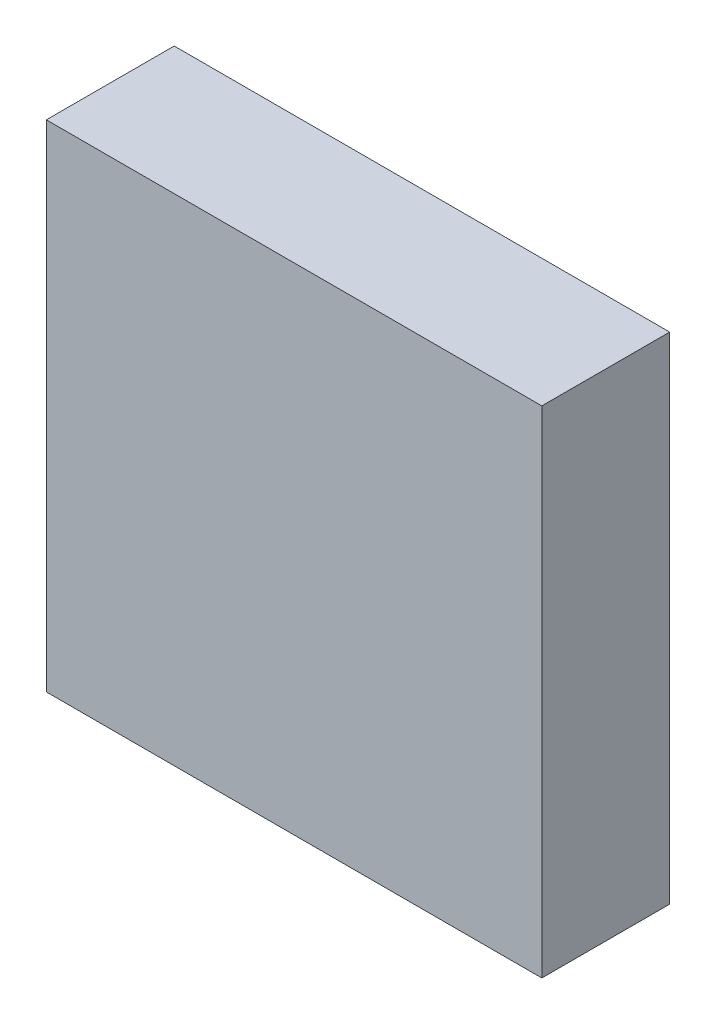
ISO-10303-21;
HEADER;
FILE_DESCRIPTION(('STEP AP214'),'2;1');
FILE_NAME('part.step','',(''),(''),'','','');
FILE_SCHEMA(('AUTOMOTIVE_DESIGN { 1 0 10303 214 1 1 1 1 }'));
ENDSEC;
DATA;
#1=APPLICATION_CONTEXT('core data for automotive mechanical design processes');
#2=APPLICATION_PROTOCOL_DEFINITION('international standard','automotive_design',2000,#1);
#3=PRODUCT_CONTEXT('',#1,'mechanical');
#4=PRODUCT('Part','Part','',(#3));
#5=PRODUCT_RELATED_PRODUCT_CATEGORY('part','',(#4));
#6=PRODUCT_DEFINITION_FORMATION('','',#4);
#7=PRODUCT_DEFINITION_CONTEXT('part definition',#1,'design');
#8=PRODUCT_DEFINITION('design','',#6,#7);
#9=PRODUCT_DEFINITION_SHAPE('','',#8);
#10=(LENGTH_UNIT() NAMED_UNIT(*) SI_UNIT(.MILLI.,.METRE.));
#11=(NAMED_UNIT(*) PLANE_ANGLE_UNIT() SI_UNIT($,.RADIAN.));
#12=(NAMED_UNIT(*) SI_UNIT($,.STERADIAN.) SOLID_ANGLE_UNIT());
#13=UNCERTAINTY_MEASURE_WITH_UNIT(LENGTH_MEASURE(1.E-05),#10,'distance_accuracy_value','');
#14=(GEOMETRIC_REPRESENTATION_CONTEXT(3) GLOBAL_UNCERTAINTY_ASSIGNED_CONTEXT((#13)) GLOBAL_UNIT_ASSIGNED_CONTEXT((#10,
#11,#12)) REPRESENTATION_CONTEXT('',''));
#15=CARTESIAN_POINT('',(0.,0.,0.));
#16=DIRECTION('',(0.,0.,1.));
#17=DIRECTION('',(1.,0.,0.));
#18=AXIS2_PLACEMENT_3D('',#15,#16,#17);
#19=CARTESIAN_POINT('',(-1.54999944,-1.54999944,0.80000094));
#20=DIRECTION('',(0.,0.,1.));
#21=DIRECTION('',(1.,0.,0.));
#22=AXIS2_PLACEMENT_3D('',#19,#20,#21);
#23=PLANE('',#22);
#24=DIRECTION('',(-1.,0.,0.));
#25=VECTOR('',#24,1.);
#26=CARTESIAN_POINT('',(1.54999944,-1.54999944,0.80000094));
#27=LINE('',#26,#25);
#28=CARTESIAN_POINT('',(1.54999944,-1.54999944,0.80000094));
#29=VERTEX_POINT('',#28);
#30=CARTESIAN_POINT('',(-1.54999944,-1.54999944,0.80000094));
#31=VERTEX_POINT('',#30);
#32=EDGE_CURVE('E26',#29,#31,#27,.T.);
#33=ORIENTED_EDGE('',*,*,#32,.F.);
#34=DIRECTION('',(0.,-1.,0.));
#35=VECTOR('',#34,1.);
#36=CARTESIAN_POINT('',(1.54999944,1.54999944,0.80000094));
#37=LINE('',#36,#35);
#38=CARTESIAN_POINT('',(1.54999944,1.54999944,0.80000094));
#39=VERTEX_POINT('',#38);
#40=EDGE_CURVE('E20',#39,#29,#37,.T.);
#41=ORIENTED_EDGE('',*,*,#40,.F.);
#42=DIRECTION('',(1.,0.,0.));
#43=VECTOR('',#42,1.);
#44=CARTESIAN_POINT('',(-1.54999944,1.54999944,0.80000094));
#45=LINE('',#44,#43);
#46=CARTESIAN_POINT('',(-1.54999944,1.54999944,0.80000094));
#47=VERTEX_POINT('',#46);
#48=EDGE_CURVE('E94',#47,#39,#45,.T.);
#49=ORIENTED_EDGE('',*,*,#48,.F.);
#50=DIRECTION('',(0.,1.,0.));
#51=VECTOR('',#50,1.);
#52=CARTESIAN_POINT('',(-1.54999944,-1.54999944,0.80000094));
#53=LINE('',#52,#51);
#54=EDGE_CURVE('E97',#31,#47,#53,.T.);
#55=ORIENTED_EDGE('',*,*,#54,.F.);
#56=EDGE_LOOP('',(#33,#41,#49,#55));
#57=FACE_BOUND('',#56,.T.);
#58=ADVANCED_FACE('F16',(#57),#23,.T.);
#59=CARTESIAN_POINT('',(-1.54999944,-1.54999944,0.));
#60=DIRECTION('',(0.,0.,1.));
#61=DIRECTION('',(1.,0.,0.));
#62=AXIS2_PLACEMENT_3D('',#59,#60,#61);
#63=PLANE('',#62);
#64=DIRECTION('',(0.,1.,0.));
#65=VECTOR('',#64,1.);
#66=CARTESIAN_POINT('',(-1.54999944,-1.54999944,0.));
#67=LINE('',#66,#65);
#68=CARTESIAN_POINT('',(-1.54999944,-1.54999944,0.));
#69=VERTEX_POINT('',#68);
#70=CARTESIAN_POINT('',(-1.54999944,1.54999944,0.));
#71=VERTEX_POINT('',#70);
#72=EDGE_CURVE('E89',#69,#71,#67,.T.);
#73=ORIENTED_EDGE('',*,*,#72,.T.);
#74=DIRECTION('',(1.,0.,0.));
#75=VECTOR('',#74,1.);
#76=CARTESIAN_POINT('',(-1.54999944,1.54999944,0.));
#77=LINE('',#76,#75);
#78=CARTESIAN_POINT('',(1.54999944,1.54999944,0.));
#79=VERTEX_POINT('',#78);
#80=EDGE_CURVE('E80',#71,#79,#77,.T.);
#81=ORIENTED_EDGE('',*,*,#80,.T.);
#82=DIRECTION('',(0.,-1.,0.));
#83=VECTOR('',#82,1.);
#84=CARTESIAN_POINT('',(1.54999944,1.54999944,0.));
#85=LINE('',#84,#83);
#86=CARTESIAN_POINT('',(1.54999944,-1.54999944,0.));
#87=VERTEX_POINT('',#86);
#88=EDGE_CURVE('E205',#79,#87,#85,.T.);
#89=ORIENTED_EDGE('',*,*,#88,.T.);
#90=DIRECTION('',(-1.,0.,0.));
#91=VECTOR('',#90,1.);
#92=CARTESIAN_POINT('',(1.54999944,-1.54999944,0.));
#93=LINE('',#92,#91);
#94=EDGE_CURVE('E11',#87,#69,#93,.T.);
#95=ORIENTED_EDGE('',*,*,#94,.T.);
#96=EDGE_LOOP('',(#73,#81,#89,#95));
#97=FACE_BOUND('',#96,.T.);
#98=ADVANCED_FACE('F90',(#97),#63,.F.);
#99=CARTESIAN_POINT('',(1.54999944,-1.54999944,0.));
#100=DIRECTION('',(0.,-1.,0.));
#101=DIRECTION('',(0.,0.,-1.));
#102=AXIS2_PLACEMENT_3D('',#99,#100,#101);
#103=PLANE('',#102);
#104=DIRECTION('',(0.,0.,1.));
#105=VECTOR('',#104,1.);
#106=CARTESIAN_POINT('',(1.54999944,-1.54999944,0.));
#107=LINE('',#106,#105);
#108=EDGE_CURVE('E116',#87,#29,#107,.T.);
#109=ORIENTED_EDGE('',*,*,#108,.T.);
#110=ORIENTED_EDGE('',*,*,#32,.T.);
#111=DIRECTION('',(0.,0.,1.));
#112=VECTOR('',#111,1.);
#113=CARTESIAN_POINT('',(-1.54999944,-1.54999944,0.));
#114=LINE('',#113,#112);
#115=EDGE_CURVE('E104',#69,#31,#114,.T.);
#116=ORIENTED_EDGE('',*,*,#115,.F.);
#117=ORIENTED_EDGE('',*,*,#94,.F.);
#118=EDGE_LOOP('',(#109,#110,#116,#117));
#119=FACE_BOUND('',#118,.T.);
#120=ADVANCED_FACE('F114',(#119),#103,.T.);
#121=CARTESIAN_POINT('',(1.54999944,1.54999944,0.));
#122=DIRECTION('',(1.,0.,0.));
#123=DIRECTION('',(0.,1.,0.));
#124=AXIS2_PLACEMENT_3D('',#121,#122,#123);
#125=PLANE('',#124);
#126=DIRECTION('',(0.,0.,1.));
#127=VECTOR('',#126,1.);
#128=CARTESIAN_POINT('',(1.54999944,1.54999944,0.));
#129=LINE('',#128,#127);
#130=EDGE_CURVE('E86',#79,#39,#129,.T.);
#131=ORIENTED_EDGE('',*,*,#130,.T.);
#132=ORIENTED_EDGE('',*,*,#40,.T.);
#133=ORIENTED_EDGE('',*,*,#108,.F.);
#134=ORIENTED_EDGE('',*,*,#88,.F.);
#135=EDGE_LOOP('',(#131,#132,#133,#134));
#136=FACE_BOUND('',#135,.T.);
#137=ADVANCED_FACE('F18',(#136),#125,.T.);
#138=CARTESIAN_POINT('',(-1.54999944,1.54999944,0.));
#139=DIRECTION('',(0.,1.,0.));
#140=DIRECTION('',(1.,0.,0.));
#141=AXIS2_PLACEMENT_3D('',#138,#139,#140);
#142=PLANE('',#141);
#143=DIRECTION('',(0.,0.,1.));
#144=VECTOR('',#143,1.);
#145=CARTESIAN_POINT('',(-1.54999944,1.54999944,0.));
#146=LINE('',#145,#144);
#147=EDGE_CURVE('E84',#71,#47,#146,.T.);
#148=ORIENTED_EDGE('',*,*,#147,.T.);
#149=ORIENTED_EDGE('',*,*,#48,.T.);
#150=ORIENTED_EDGE('',*,*,#130,.F.);
#151=ORIENTED_EDGE('',*,*,#80,.F.);
#152=EDGE_LOOP('',(#148,#149,#150,#151));
#153=FACE_BOUND('',#152,.T.);
#154=ADVANCED_FACE('F81',(#153),#142,.T.);
#155=CARTESIAN_POINT('',(-1.54999944,-1.54999944,0.));
#156=DIRECTION('',(-1.,0.,0.));
#157=DIRECTION('',(0.,0.,1.));
#158=AXIS2_PLACEMENT_3D('',#155,#156,#157);
#159=PLANE('',#158);
#160=ORIENTED_EDGE('',*,*,#115,.T.);
#161=ORIENTED_EDGE('',*,*,#54,.T.);
#162=ORIENTED_EDGE('',*,*,#147,.F.);
#163=ORIENTED_EDGE('',*,*,#72,.F.);
#164=EDGE_LOOP('',(#160,#161,#162,#163));
#165=FACE_BOUND('',#164,.T.);
#166=ADVANCED_FACE('F96',(#165),#159,.T.);
#167=CLOSED_SHELL('',(#58,#98,#120,#137,#154,#166));
#168=MANIFOLD_SOLID_BREP('B1',#167);
#169=ADVANCED_BREP_SHAPE_REPRESENTATION('',(#18,#168),#14);
#170=SHAPE_DEFINITION_REPRESENTATION(#9,#169);
ENDSEC;
END-ISO-10303-21;
